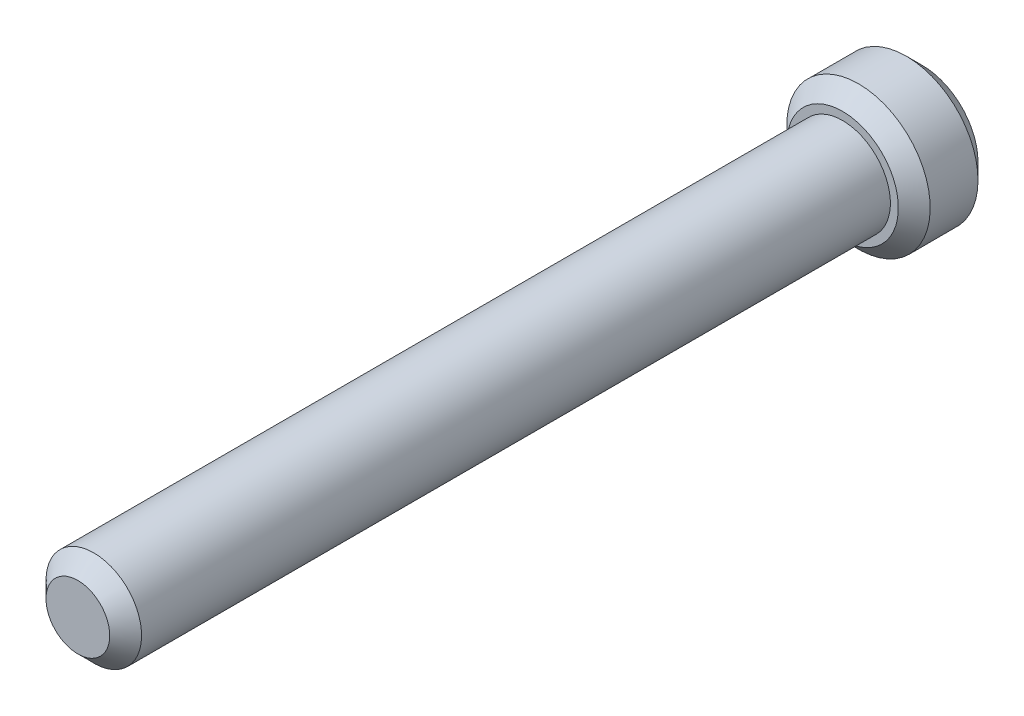
ISO-10303-21;
HEADER;
FILE_DESCRIPTION(('STEP AP214'),'2;1');
FILE_NAME('part.step','',(''),(''),'','','');
FILE_SCHEMA(('AUTOMOTIVE_DESIGN { 1 0 10303 214 1 1 1 1 }'));
ENDSEC;
DATA;
#1=APPLICATION_CONTEXT('core data for automotive mechanical design processes');
#2=APPLICATION_PROTOCOL_DEFINITION('international standard','automotive_design',2000,#1);
#3=PRODUCT_CONTEXT('',#1,'mechanical');
#4=PRODUCT('Part','Part','',(#3));
#5=PRODUCT_RELATED_PRODUCT_CATEGORY('part','',(#4));
#6=PRODUCT_DEFINITION_FORMATION('','',#4);
#7=PRODUCT_DEFINITION_CONTEXT('part definition',#1,'design');
#8=PRODUCT_DEFINITION('design','',#6,#7);
#9=PRODUCT_DEFINITION_SHAPE('','',#8);
#10=(LENGTH_UNIT() NAMED_UNIT(*) SI_UNIT(.MILLI.,.METRE.));
#11=(NAMED_UNIT(*) PLANE_ANGLE_UNIT() SI_UNIT($,.RADIAN.));
#12=(NAMED_UNIT(*) SI_UNIT($,.STERADIAN.) SOLID_ANGLE_UNIT());
#13=UNCERTAINTY_MEASURE_WITH_UNIT(LENGTH_MEASURE(1.E-05),#10,'distance_accuracy_value','');
#14=(GEOMETRIC_REPRESENTATION_CONTEXT(3) GLOBAL_UNCERTAINTY_ASSIGNED_CONTEXT((#13)) GLOBAL_UNIT_ASSIGNED_CONTEXT((#10,
#11,#12)) REPRESENTATION_CONTEXT('',''));
#15=CARTESIAN_POINT('',(0.,0.,0.));
#16=DIRECTION('',(0.,0.,1.));
#17=DIRECTION('',(1.,0.,0.));
#18=AXIS2_PLACEMENT_3D('',#15,#16,#17);
#19=CARTESIAN_POINT('',(-1.299038106,-1.5,1.5));
#20=DIRECTION('',(0.,0.,1.));
#21=DIRECTION('',(1.,0.,0.));
#22=AXIS2_PLACEMENT_3D('',#19,#20,#21);
#23=PLANE('',#22);
#24=DIRECTION('',(-0.866025403838329,0.499999999906659,0.));
#25=VECTOR('',#24,1.);
#26=CARTESIAN_POINT('',(0.,-1.5,1.5));
#27=LINE('',#26,#25);
#28=CARTESIAN_POINT('',(-1.299038105988,-0.750000000006928,1.5));
#29=VERTEX_POINT('',#28);
#30=CARTESIAN_POINT('',(-5.44638257218606E-10,-1.49999999968555,1.5));
#31=VERTEX_POINT('',#30);
#32=EDGE_CURVE('E85',#29,#31,#27,.F.);
#33=ORIENTED_EDGE('',*,*,#32,.F.);
#34=DIRECTION('',(0.,1.,0.));
#35=VECTOR('',#34,1.);
#36=CARTESIAN_POINT('',(-1.299038106,-0.75,1.5));
#37=LINE('',#36,#35);
#38=CARTESIAN_POINT('',(-1.299038106,0.750000000006928,1.5));
#39=VERTEX_POINT('',#38);
#40=EDGE_CURVE('E134',#39,#29,#37,.F.);
#41=ORIENTED_EDGE('',*,*,#40,.F.);
#42=DIRECTION('',(0.866025403838329,0.499999999906659,0.));
#43=VECTOR('',#42,1.);
#44=CARTESIAN_POINT('',(-1.299038106,0.75,1.5));
#45=LINE('',#44,#43);
#46=CARTESIAN_POINT('',(5.44638352086296E-10,1.49999999968555,1.5));
#47=VERTEX_POINT('',#46);
#48=EDGE_CURVE('E128',#47,#39,#45,.F.);
#49=ORIENTED_EDGE('',*,*,#48,.F.);
#50=DIRECTION('',(0.866025403838329,-0.499999999906659,0.));
#51=VECTOR('',#50,1.);
#52=CARTESIAN_POINT('',(0.,1.5,1.5));
#53=LINE('',#52,#51);
#54=CARTESIAN_POINT('',(1.299038105988,0.750000000006928,1.5));
#55=VERTEX_POINT('',#54);
#56=EDGE_CURVE('E74',#55,#47,#53,.F.);
#57=ORIENTED_EDGE('',*,*,#56,.F.);
#58=DIRECTION('',(0.,1.,0.));
#59=VECTOR('',#58,1.);
#60=CARTESIAN_POINT('',(1.299038106,0.75,1.5));
#61=LINE('',#60,#59);
#62=CARTESIAN_POINT('',(1.299038106,-0.750000000006928,1.5));
#63=VERTEX_POINT('',#62);
#64=EDGE_CURVE('E71',#63,#55,#61,.T.);
#65=ORIENTED_EDGE('',*,*,#64,.F.);
#66=DIRECTION('',(-0.866025403838329,-0.499999999906659,0.));
#67=VECTOR('',#66,1.);
#68=CARTESIAN_POINT('',(1.299038106,-0.75,1.5));
#69=LINE('',#68,#67);
#70=EDGE_CURVE('E68',#31,#63,#69,.F.);
#71=ORIENTED_EDGE('',*,*,#70,.F.);
#72=EDGE_LOOP('',(#33,#41,#49,#57,#65,#71));
#73=FACE_BOUND('',#72,.T.);
#74=ADVANCED_FACE('F17',(#73),#23,.F.);
#75=CARTESIAN_POINT('',(1.299038106,0.75,0.));
#76=DIRECTION('',(-1.,0.,0.));
#77=DIRECTION('',(0.,0.,1.));
#78=AXIS2_PLACEMENT_3D('',#75,#76,#77);
#79=PLANE('',#78);
#80=DIRECTION('',(0.,1.,0.));
#81=VECTOR('',#80,1.);
#82=CARTESIAN_POINT('',(1.299038105952,-1.771,0.));
#83=LINE('',#82,#81);
#84=CARTESIAN_POINT('',(1.299038105976,0.750000000013856,0.));
#85=VERTEX_POINT('',#84);
#86=CARTESIAN_POINT('',(1.299038105988,-0.750000000020785,0.));
#87=VERTEX_POINT('',#86);
#88=EDGE_CURVE('E82',#85,#87,#83,.F.);
#89=ORIENTED_EDGE('',*,*,#88,.T.);
#90=DIRECTION('',(0.,0.,1.));
#91=VECTOR('',#90,1.);
#92=CARTESIAN_POINT('',(1.299038106,-0.75,0.));
#93=LINE('',#92,#91);
#94=EDGE_CURVE('E79',#63,#87,#93,.F.);
#95=ORIENTED_EDGE('',*,*,#94,.F.);
#96=ORIENTED_EDGE('',*,*,#64,.T.);
#97=DIRECTION('',(0.,0.,1.));
#98=VECTOR('',#97,1.);
#99=CARTESIAN_POINT('',(1.299038105952,0.750000000027713,0.));
#100=LINE('',#99,#98);
#101=EDGE_CURVE('E121',#85,#55,#100,.T.);
#102=ORIENTED_EDGE('',*,*,#101,.F.);
#103=EDGE_LOOP('',(#89,#95,#96,#102));
#104=FACE_BOUND('',#103,.T.);
#105=ADVANCED_FACE('F80',(#104),#79,.T.);
#106=CARTESIAN_POINT('',(1.299038106,-0.75,0.));
#107=DIRECTION('',(-0.499999999906659,0.866025403838329,0.));
#108=DIRECTION('',(-0.866025403838329,-0.499999999906659,0.));
#109=AXIS2_PLACEMENT_3D('',#106,#107,#108);
#110=PLANE('',#109);
#111=DIRECTION('',(-0.866025403838329,-0.499999999906659,0.));
#112=VECTOR('',#111,1.);
#113=CARTESIAN_POINT('',(1.299038105952,-0.750000000027713,0.));
#114=LINE('',#113,#112);
#115=CARTESIAN_POINT('',(-1.81546044401176E-10,-1.49999999989518,0.));
#116=VERTEX_POINT('',#115);
#117=EDGE_CURVE('E118',#87,#116,#114,.T.);
#118=ORIENTED_EDGE('',*,*,#117,.T.);
#119=DIRECTION('',(0.,0.,1.));
#120=VECTOR('',#119,1.);
#121=CARTESIAN_POINT('',(-7.26184373535166E-10,-1.49999999958074,0.));
#122=LINE('',#121,#120);
#123=EDGE_CURVE('E89',#31,#116,#122,.F.);
#124=ORIENTED_EDGE('',*,*,#123,.F.);
#125=ORIENTED_EDGE('',*,*,#70,.T.);
#126=ORIENTED_EDGE('',*,*,#94,.T.);
#127=EDGE_LOOP('',(#118,#124,#125,#126));
#128=FACE_BOUND('',#127,.T.);
#129=ADVANCED_FACE('F87',(#128),#110,.T.);
#130=CARTESIAN_POINT('',(0.,-1.5,0.));
#131=DIRECTION('',(0.499999999906659,0.866025403838329,0.));
#132=DIRECTION('',(-0.866025403838329,0.499999999906659,0.));
#133=AXIS2_PLACEMENT_3D('',#130,#131,#132);
#134=PLANE('',#133);
#135=DIRECTION('',(-0.866025403838329,0.499999999906659,0.));
#136=VECTOR('',#135,1.);
#137=CARTESIAN_POINT('',(0.,-1.5,0.));
#138=LINE('',#137,#136);
#139=CARTESIAN_POINT('',(-1.299038105964,-0.750000000020785,0.));
#140=VERTEX_POINT('',#139);
#141=EDGE_CURVE('E116',#116,#140,#138,.T.);
#142=ORIENTED_EDGE('',*,*,#141,.T.);
#143=DIRECTION('',(0.,0.,-1.));
#144=VECTOR('',#143,1.);
#145=CARTESIAN_POINT('',(-1.299038106,-0.75,0.));
#146=LINE('',#145,#144);
#147=EDGE_CURVE('E131',#29,#140,#146,.T.);
#148=ORIENTED_EDGE('',*,*,#147,.F.);
#149=ORIENTED_EDGE('',*,*,#32,.T.);
#150=ORIENTED_EDGE('',*,*,#123,.T.);
#151=EDGE_LOOP('',(#142,#148,#149,#150));
#152=FACE_BOUND('',#151,.T.);
#153=ADVANCED_FACE('F139',(#152),#134,.T.);
#154=CARTESIAN_POINT('',(-1.299038106,-0.75,0.));
#155=DIRECTION('',(1.,0.,0.));
#156=DIRECTION('',(0.,0.,-1.));
#157=AXIS2_PLACEMENT_3D('',#154,#155,#156);
#158=PLANE('',#157);
#159=DIRECTION('',(0.,1.,0.));
#160=VECTOR('',#159,1.);
#161=CARTESIAN_POINT('',(-1.299038105952,-1.771,0.));
#162=LINE('',#161,#160);
#163=CARTESIAN_POINT('',(-1.299038105988,0.750000000020785,0.));
#164=VERTEX_POINT('',#163);
#165=EDGE_CURVE('E114',#140,#164,#162,.T.);
#166=ORIENTED_EDGE('',*,*,#165,.T.);
#167=DIRECTION('',(0.,0.,1.));
#168=VECTOR('',#167,1.);
#169=CARTESIAN_POINT('',(-1.299038106,0.75,0.));
#170=LINE('',#169,#168);
#171=EDGE_CURVE('E126',#39,#164,#170,.F.);
#172=ORIENTED_EDGE('',*,*,#171,.F.);
#173=ORIENTED_EDGE('',*,*,#40,.T.);
#174=ORIENTED_EDGE('',*,*,#147,.T.);
#175=EDGE_LOOP('',(#166,#172,#173,#174));
#176=FACE_BOUND('',#175,.T.);
#177=ADVANCED_FACE('F143',(#176),#158,.T.);
#178=CARTESIAN_POINT('',(-1.299038106,0.75,0.));
#179=DIRECTION('',(0.499999999906659,-0.866025403838329,0.));
#180=DIRECTION('',(0.866025403838329,0.499999999906659,0.));
#181=AXIS2_PLACEMENT_3D('',#178,#179,#180);
#182=PLANE('',#181);
#183=DIRECTION('',(0.866025403838329,0.499999999906659,0.));
#184=VECTOR('',#183,1.);
#185=CARTESIAN_POINT('',(-1.299038105952,0.750000000027713,0.));
#186=LINE('',#185,#184);
#187=CARTESIAN_POINT('',(1.81546091835022E-10,1.49999999989518,0.));
#188=VERTEX_POINT('',#187);
#189=EDGE_CURVE('E35',#164,#188,#186,.T.);
#190=ORIENTED_EDGE('',*,*,#189,.T.);
#191=DIRECTION('',(0.,0.,1.));
#192=VECTOR('',#191,1.);
#193=CARTESIAN_POINT('',(7.26184373535166E-10,1.49999999958074,0.));
#194=LINE('',#193,#192);
#195=EDGE_CURVE('E123',#47,#188,#194,.F.);
#196=ORIENTED_EDGE('',*,*,#195,.F.);
#197=ORIENTED_EDGE('',*,*,#48,.T.);
#198=ORIENTED_EDGE('',*,*,#171,.T.);
#199=EDGE_LOOP('',(#190,#196,#197,#198));
#200=FACE_BOUND('',#199,.T.);
#201=ADVANCED_FACE('F145',(#200),#182,.T.);
#202=CARTESIAN_POINT('',(0.,1.5,0.));
#203=DIRECTION('',(-0.499999999906659,-0.866025403838329,0.));
#204=DIRECTION('',(0.866025403838329,-0.499999999906659,0.));
#205=AXIS2_PLACEMENT_3D('',#202,#203,#204);
#206=PLANE('',#205);
#207=DIRECTION('',(0.866025403838329,-0.499999999906659,0.));
#208=VECTOR('',#207,1.);
#209=CARTESIAN_POINT('',(0.,1.5,0.));
#210=LINE('',#209,#208);
#211=EDGE_CURVE('E110',#188,#85,#210,.T.);
#212=ORIENTED_EDGE('',*,*,#211,.T.);
#213=ORIENTED_EDGE('',*,*,#101,.T.);
#214=ORIENTED_EDGE('',*,*,#56,.T.);
#215=ORIENTED_EDGE('',*,*,#195,.T.);
#216=EDGE_LOOP('',(#212,#213,#214,#215));
#217=FACE_BOUND('',#216,.T.);
#218=ADVANCED_FACE('F148',(#217),#206,.T.);
#219=CARTESIAN_POINT('',(-1.771,-1.771,0.));
#220=DIRECTION('',(0.,0.,1.));
#221=DIRECTION('',(1.,0.,0.));
#222=AXIS2_PLACEMENT_3D('',#219,#220,#221);
#223=PLANE('',#222);
#224=CARTESIAN_POINT('',(0.,0.,0.));
#225=DIRECTION('',(0.,0.,1.));
#226=DIRECTION('',(1.,0.,0.));
#227=AXIS2_PLACEMENT_3D('',#224,#225,#226);
#228=CIRCLE('',#227,1.75000000001546);
#229=CARTESIAN_POINT('',(1.75000000001546,0.,0.));
#230=VERTEX_POINT('',#229);
#231=EDGE_CURVE('E20',#230,#230,#228,.T.);
#232=ORIENTED_EDGE('',*,*,#231,.F.);
#233=EDGE_LOOP('',(#232));
#234=FACE_BOUND('',#233,.T.);
#235=ORIENTED_EDGE('',*,*,#189,.F.);
#236=ORIENTED_EDGE('',*,*,#165,.F.);
#237=ORIENTED_EDGE('',*,*,#141,.F.);
#238=ORIENTED_EDGE('',*,*,#117,.F.);
#239=ORIENTED_EDGE('',*,*,#88,.F.);
#240=ORIENTED_EDGE('',*,*,#211,.F.);
#241=EDGE_LOOP('',(#235,#236,#237,#238,#239,#240));
#242=FACE_BOUND('',#241,.T.);
#243=ADVANCED_FACE('F150',(#234,#242),#223,.F.);
#244=CARTESIAN_POINT('',(0.,0.,0.499999999988177));
#245=DIRECTION('',(0.,0.,1.));
#246=DIRECTION('',(1.,0.,0.));
#247=AXIS2_PLACEMENT_3D('',#244,#245,#246);
#248=CONICAL_SURFACE('',#247,2.25000000000364,0.785398163397448);
#249=CARTESIAN_POINT('',(0.,0.,0.499999999999945));
#250=DIRECTION('',(0.,0.,-1.));
#251=DIRECTION('',(-1.,0.,0.));
#252=AXIS2_PLACEMENT_3D('',#249,#250,#251);
#253=CIRCLE('',#252,2.25);
#254=CARTESIAN_POINT('',(-2.25,0.,0.499999999999945));
#255=VERTEX_POINT('',#254);
#256=EDGE_CURVE('E102',#255,#255,#253,.F.);
#257=ORIENTED_EDGE('',*,*,#256,.F.);
#258=EDGE_LOOP('',(#257));
#259=FACE_BOUND('',#258,.T.);
#260=ORIENTED_EDGE('',*,*,#231,.T.);
#261=EDGE_LOOP('',(#260));
#262=FACE_BOUND('',#261,.T.);
#263=ADVANCED_FACE('F152',(#259,#262),#248,.T.);
#264=CARTESIAN_POINT('',(0.,0.,2.));
#265=DIRECTION('',(0.,0.,-1.));
#266=DIRECTION('',(-1.,0.,0.));
#267=AXIS2_PLACEMENT_3D('',#264,#265,#266);
#268=CYLINDRICAL_SURFACE('',#267,2.25);
#269=ORIENTED_EDGE('',*,*,#256,.T.);
#270=EDGE_LOOP('',(#269));
#271=FACE_BOUND('',#270,.T.);
#272=CARTESIAN_POINT('',(0.,0.,2.00000000006639));
#273=DIRECTION('',(0.,0.,-1.));
#274=DIRECTION('',(0.,1.,0.));
#275=AXIS2_PLACEMENT_3D('',#272,#273,#274);
#276=CIRCLE('',#275,2.24999999994679);
#277=CARTESIAN_POINT('',(0.,2.24999999994679,2.00000000006639));
#278=VERTEX_POINT('',#277);
#279=EDGE_CURVE('E98',#278,#278,#276,.F.);
#280=ORIENTED_EDGE('',*,*,#279,.F.);
#281=EDGE_LOOP('',(#280));
#282=FACE_BOUND('',#281,.T.);
#283=ADVANCED_FACE('F160',(#271,#282),#268,.T.);
#284=CARTESIAN_POINT('',(0.,0.,26.5));
#285=DIRECTION('',(0.,0.,1.));
#286=DIRECTION('',(1.,0.,0.));
#287=AXIS2_PLACEMENT_3D('',#284,#285,#286);
#288=PLANE('',#287);
#289=CARTESIAN_POINT('',(0.,0.,26.4999999999986));
#290=DIRECTION('',(0.,0.,-1.));
#291=DIRECTION('',(0.,1.,0.));
#292=AXIS2_PLACEMENT_3D('',#289,#290,#291);
#293=CIRCLE('',#292,0.99999999991951);
#294=CARTESIAN_POINT('',(0.,0.99999999991951,26.4999999999986));
#295=VERTEX_POINT('',#294);
#296=EDGE_CURVE('E96',#295,#295,#293,.T.);
#297=ORIENTED_EDGE('',*,*,#296,.F.);
#298=EDGE_LOOP('',(#297));
#299=FACE_BOUND('',#298,.T.);
#300=ADVANCED_FACE('F184',(#299),#288,.T.);
#301=CARTESIAN_POINT('',(0.,0.,2.00000000018008));
#302=DIRECTION('',(0.,0.,-1.));
#303=DIRECTION('',(-1.,0.,0.));
#304=AXIS2_PLACEMENT_3D('',#301,#302,#303);
#305=CONICAL_SURFACE('',#304,2.24999999983311,0.785398163397448);
#306=ORIENTED_EDGE('',*,*,#279,.T.);
#307=EDGE_LOOP('',(#306));
#308=FACE_BOUND('',#307,.T.);
#309=CARTESIAN_POINT('',(0.,0.,2.50000000005457));
#310=DIRECTION('',(0.,0.,-1.));
#311=DIRECTION('',(-1.,0.,0.));
#312=AXIS2_PLACEMENT_3D('',#309,#310,#311);
#313=CIRCLE('',#312,1.74999999995862);
#314=CARTESIAN_POINT('',(-1.74999999995862,0.,2.50000000005457));
#315=VERTEX_POINT('',#314);
#316=EDGE_CURVE('E94',#315,#315,#313,.F.);
#317=ORIENTED_EDGE('',*,*,#316,.F.);
#318=EDGE_LOOP('',(#317));
#319=FACE_BOUND('',#318,.T.);
#320=ADVANCED_FACE('F180',(#308,#319),#305,.T.);
#321=CARTESIAN_POINT('',(0.,0.,26.0000000000673));
#322=DIRECTION('',(0.,0.,-1.));
#323=DIRECTION('',(0.,1.,0.));
#324=AXIS2_PLACEMENT_3D('',#321,#322,#323);
#325=CONICAL_SURFACE('',#324,1.49999999985084,0.785398163397448);
#326=CARTESIAN_POINT('',(0.,0.,26.));
#327=DIRECTION('',(0.,0.,-1.));
#328=DIRECTION('',(-1.,0.,0.));
#329=AXIS2_PLACEMENT_3D('',#326,#327,#328);
#330=CIRCLE('',#329,1.5);
#331=CARTESIAN_POINT('',(-1.5,0.,26.));
#332=VERTEX_POINT('',#331);
#333=EDGE_CURVE('E26',#332,#332,#330,.T.);
#334=ORIENTED_EDGE('',*,*,#333,.F.);
#335=EDGE_LOOP('',(#334));
#336=FACE_BOUND('',#335,.T.);
#337=ORIENTED_EDGE('',*,*,#296,.T.);
#338=EDGE_LOOP('',(#337));
#339=FACE_BOUND('',#338,.T.);
#340=ADVANCED_FACE('F173',(#336,#339),#325,.T.);
#341=CARTESIAN_POINT('',(-1.771,-1.771,2.5));
#342=DIRECTION('',(0.,0.,1.));
#343=DIRECTION('',(1.,0.,0.));
#344=AXIS2_PLACEMENT_3D('',#341,#342,#343);
#345=PLANE('',#344);
#346=ORIENTED_EDGE('',*,*,#316,.T.);
#347=EDGE_LOOP('',(#346));
#348=FACE_BOUND('',#347,.T.);
#349=CARTESIAN_POINT('',(0.,0.,2.5));
#350=DIRECTION('',(0.,0.,-1.));
#351=DIRECTION('',(-1.,0.,0.));
#352=AXIS2_PLACEMENT_3D('',#349,#350,#351);
#353=CIRCLE('',#352,1.5);
#354=CARTESIAN_POINT('',(-1.5,0.,2.5));
#355=VERTEX_POINT('',#354);
#356=EDGE_CURVE('E11',#355,#355,#353,.F.);
#357=ORIENTED_EDGE('',*,*,#356,.F.);
#358=EDGE_LOOP('',(#357));
#359=FACE_BOUND('',#358,.T.);
#360=ADVANCED_FACE('F167',(#348,#359),#345,.T.);
#361=CARTESIAN_POINT('',(0.,0.,22.5));
#362=DIRECTION('',(0.,0.,-1.));
#363=DIRECTION('',(-1.,0.,0.));
#364=AXIS2_PLACEMENT_3D('',#361,#362,#363);
#365=CYLINDRICAL_SURFACE('',#364,1.5);
#366=ORIENTED_EDGE('',*,*,#356,.T.);
#367=EDGE_LOOP('',(#366));
#368=FACE_BOUND('',#367,.T.);
#369=ORIENTED_EDGE('',*,*,#333,.T.);
#370=EDGE_LOOP('',(#369));
#371=FACE_BOUND('',#370,.T.);
#372=ADVANCED_FACE('F165',(#368,#371),#365,.T.);
#373=CLOSED_SHELL('',(#74,#105,#129,#153,#177,#201,#218,#243,#263,#283,#300,#320,#340,#360,#372));
#374=MANIFOLD_SOLID_BREP('B1',#373);
#375=ADVANCED_BREP_SHAPE_REPRESENTATION('',(#18,#374),#14);
#376=SHAPE_DEFINITION_REPRESENTATION(#9,#375);
ENDSEC;
END-ISO-10303-21;
